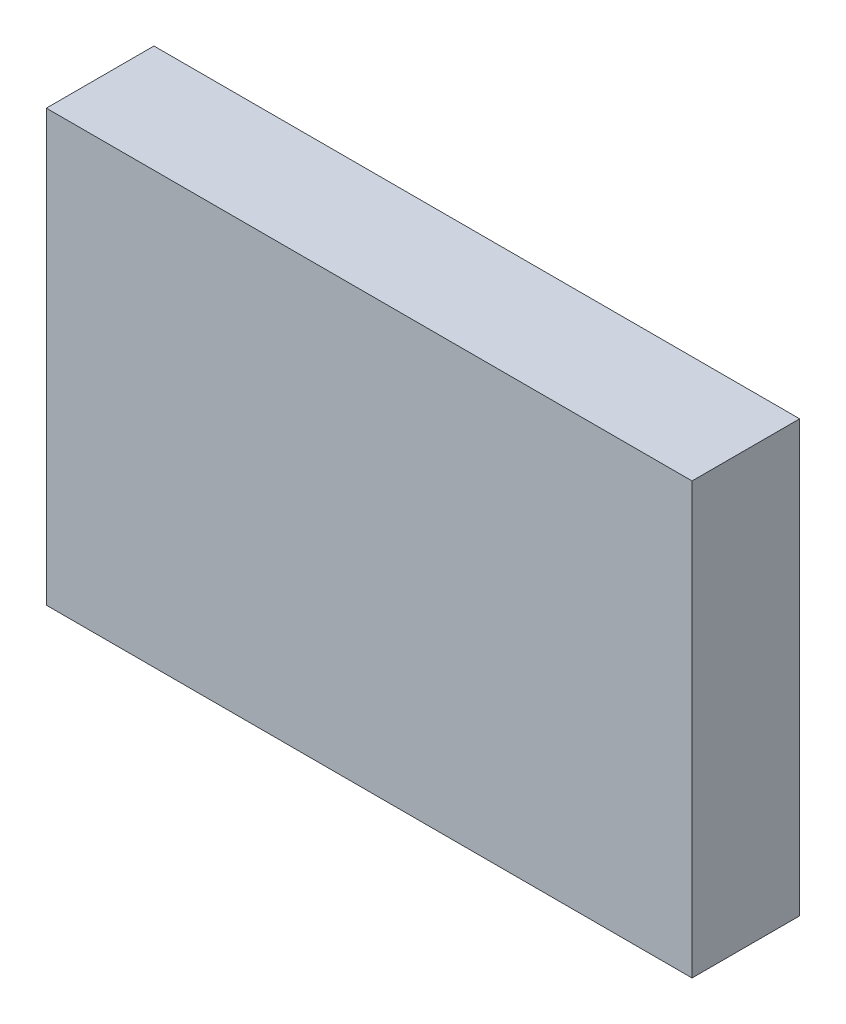
ISO-10303-21;
HEADER;
FILE_DESCRIPTION(('STEP AP214'),'2;1');
FILE_NAME('part.step','',(''),(''),'','','');
FILE_SCHEMA(('AUTOMOTIVE_DESIGN { 1 0 10303 214 1 1 1 1 }'));
ENDSEC;
DATA;
#1=APPLICATION_CONTEXT('core data for automotive mechanical design processes');
#2=APPLICATION_PROTOCOL_DEFINITION('international standard','automotive_design',2000,#1);
#3=PRODUCT_CONTEXT('',#1,'mechanical');
#4=PRODUCT('Part','Part','',(#3));
#5=PRODUCT_RELATED_PRODUCT_CATEGORY('part','',(#4));
#6=PRODUCT_DEFINITION_FORMATION('','',#4);
#7=PRODUCT_DEFINITION_CONTEXT('part definition',#1,'design');
#8=PRODUCT_DEFINITION('design','',#6,#7);
#9=PRODUCT_DEFINITION_SHAPE('','',#8);
#10=(LENGTH_UNIT() NAMED_UNIT(*) SI_UNIT(.MILLI.,.METRE.));
#11=(NAMED_UNIT(*) PLANE_ANGLE_UNIT() SI_UNIT($,.RADIAN.));
#12=(NAMED_UNIT(*) SI_UNIT($,.STERADIAN.) SOLID_ANGLE_UNIT());
#13=UNCERTAINTY_MEASURE_WITH_UNIT(LENGTH_MEASURE(1.E-05),#10,'distance_accuracy_value','');
#14=(GEOMETRIC_REPRESENTATION_CONTEXT(3) GLOBAL_UNCERTAINTY_ASSIGNED_CONTEXT((#13)) GLOBAL_UNIT_ASSIGNED_CONTEXT((#10,
#11,#12)) REPRESENTATION_CONTEXT('',''));
#15=CARTESIAN_POINT('',(0.,0.,0.));
#16=DIRECTION('',(0.,0.,1.));
#17=DIRECTION('',(1.,0.,0.));
#18=AXIS2_PLACEMENT_3D('',#15,#16,#17);
#19=CARTESIAN_POINT('',(-15.,-10.,5.));
#20=DIRECTION('',(1.,0.,0.));
#21=DIRECTION('',(0.,0.,-1.));
#22=AXIS2_PLACEMENT_3D('',#19,#20,#21);
#23=PLANE('',#22);
#24=DIRECTION('',(0.,-1.,0.));
#25=VECTOR('',#24,1.);
#26=CARTESIAN_POINT('',(-15.,-10.,0.));
#27=LINE('',#26,#25);
#28=CARTESIAN_POINT('',(-15.,9.99999999999999,0.));
#29=VERTEX_POINT('',#28);
#30=CARTESIAN_POINT('',(-15.,-10.,0.));
#31=VERTEX_POINT('',#30);
#32=EDGE_CURVE('E107',#29,#31,#27,.T.);
#33=ORIENTED_EDGE('',*,*,#32,.T.);
#34=DIRECTION('',(0.,0.,-1.));
#35=VECTOR('',#34,1.);
#36=CARTESIAN_POINT('',(-15.,-10.,5.));
#37=LINE('',#36,#35);
#38=CARTESIAN_POINT('',(-15.,-10.,5.));
#39=VERTEX_POINT('',#38);
#40=EDGE_CURVE('E11',#39,#31,#37,.T.);
#41=ORIENTED_EDGE('',*,*,#40,.F.);
#42=DIRECTION('',(0.,-1.,0.));
#43=VECTOR('',#42,1.);
#44=CARTESIAN_POINT('',(-15.,-10.,5.));
#45=LINE('',#44,#43);
#46=CARTESIAN_POINT('',(-15.,9.99999999999999,5.));
#47=VERTEX_POINT('',#46);
#48=EDGE_CURVE('E91',#47,#39,#45,.T.);
#49=ORIENTED_EDGE('',*,*,#48,.F.);
#50=DIRECTION('',(0.,0.,-1.));
#51=VECTOR('',#50,1.);
#52=CARTESIAN_POINT('',(-15.,9.99999999999999,5.));
#53=LINE('',#52,#51);
#54=EDGE_CURVE('E103',#47,#29,#53,.T.);
#55=ORIENTED_EDGE('',*,*,#54,.T.);
#56=EDGE_LOOP('',(#33,#41,#49,#55));
#57=FACE_BOUND('',#56,.T.);
#58=ADVANCED_FACE('F39',(#57),#23,.F.);
#59=CARTESIAN_POINT('',(15.,-10.,5.));
#60=DIRECTION('',(0.,1.,0.));
#61=DIRECTION('',(-1.,0.,0.));
#62=AXIS2_PLACEMENT_3D('',#59,#60,#61);
#63=PLANE('',#62);
#64=DIRECTION('',(1.,0.,0.));
#65=VECTOR('',#64,1.);
#66=CARTESIAN_POINT('',(15.,-10.,0.));
#67=LINE('',#66,#65);
#68=CARTESIAN_POINT('',(15.,-10.,0.));
#69=VERTEX_POINT('',#68);
#70=EDGE_CURVE('E96',#31,#69,#67,.T.);
#71=ORIENTED_EDGE('',*,*,#70,.T.);
#72=DIRECTION('',(0.,0.,-1.));
#73=VECTOR('',#72,1.);
#74=CARTESIAN_POINT('',(15.,-10.,5.));
#75=LINE('',#74,#73);
#76=CARTESIAN_POINT('',(15.,-10.,5.));
#77=VERTEX_POINT('',#76);
#78=EDGE_CURVE('E48',#77,#69,#75,.T.);
#79=ORIENTED_EDGE('',*,*,#78,.F.);
#80=DIRECTION('',(1.,0.,0.));
#81=VECTOR('',#80,1.);
#82=CARTESIAN_POINT('',(15.,-10.,5.));
#83=LINE('',#82,#81);
#84=EDGE_CURVE('E86',#39,#77,#83,.T.);
#85=ORIENTED_EDGE('',*,*,#84,.F.);
#86=ORIENTED_EDGE('',*,*,#40,.T.);
#87=EDGE_LOOP('',(#71,#79,#85,#86));
#88=FACE_BOUND('',#87,.T.);
#89=ADVANCED_FACE('F95',(#88),#63,.F.);
#90=CARTESIAN_POINT('',(15.,-10.,5.));
#91=DIRECTION('',(-1.,0.,0.));
#92=DIRECTION('',(0.,0.,1.));
#93=AXIS2_PLACEMENT_3D('',#90,#91,#92);
#94=PLANE('',#93);
#95=DIRECTION('',(0.,1.,0.));
#96=VECTOR('',#95,1.);
#97=CARTESIAN_POINT('',(15.,-10.,0.));
#98=LINE('',#97,#96);
#99=CARTESIAN_POINT('',(15.,10.,0.));
#100=VERTEX_POINT('',#99);
#101=EDGE_CURVE('E73',#69,#100,#98,.T.);
#102=ORIENTED_EDGE('',*,*,#101,.T.);
#103=DIRECTION('',(0.,0.,-1.));
#104=VECTOR('',#103,1.);
#105=CARTESIAN_POINT('',(15.,10.,5.));
#106=LINE('',#105,#104);
#107=CARTESIAN_POINT('',(15.,10.,5.));
#108=VERTEX_POINT('',#107);
#109=EDGE_CURVE('E98',#108,#100,#106,.T.);
#110=ORIENTED_EDGE('',*,*,#109,.F.);
#111=DIRECTION('',(0.,1.,0.));
#112=VECTOR('',#111,1.);
#113=CARTESIAN_POINT('',(15.,-10.,5.));
#114=LINE('',#113,#112);
#115=EDGE_CURVE('E89',#77,#108,#114,.T.);
#116=ORIENTED_EDGE('',*,*,#115,.F.);
#117=ORIENTED_EDGE('',*,*,#78,.T.);
#118=EDGE_LOOP('',(#102,#110,#116,#117));
#119=FACE_BOUND('',#118,.T.);
#120=ADVANCED_FACE('F99',(#119),#94,.F.);
#121=CARTESIAN_POINT('',(15.,10.,5.));
#122=DIRECTION('',(0.,-1.,0.));
#123=DIRECTION('',(1.,0.,0.));
#124=AXIS2_PLACEMENT_3D('',#121,#122,#123);
#125=PLANE('',#124);
#126=DIRECTION('',(-1.,0.,0.));
#127=VECTOR('',#126,1.);
#128=CARTESIAN_POINT('',(15.,10.,0.));
#129=LINE('',#128,#127);
#130=EDGE_CURVE('E79',#100,#29,#129,.T.);
#131=ORIENTED_EDGE('',*,*,#130,.T.);
#132=ORIENTED_EDGE('',*,*,#54,.F.);
#133=DIRECTION('',(-1.,0.,0.));
#134=VECTOR('',#133,1.);
#135=CARTESIAN_POINT('',(15.,10.,5.));
#136=LINE('',#135,#134);
#137=EDGE_CURVE('E56',#108,#47,#136,.T.);
#138=ORIENTED_EDGE('',*,*,#137,.F.);
#139=ORIENTED_EDGE('',*,*,#109,.T.);
#140=EDGE_LOOP('',(#131,#132,#138,#139));
#141=FACE_BOUND('',#140,.T.);
#142=ADVANCED_FACE('F120',(#141),#125,.F.);
#143=CARTESIAN_POINT('',(0.,0.,5.));
#144=DIRECTION('',(0.,0.,1.));
#145=DIRECTION('',(1.,0.,0.));
#146=AXIS2_PLACEMENT_3D('',#143,#144,#145);
#147=PLANE('',#146);
#148=ORIENTED_EDGE('',*,*,#48,.T.);
#149=ORIENTED_EDGE('',*,*,#84,.T.);
#150=ORIENTED_EDGE('',*,*,#115,.T.);
#151=ORIENTED_EDGE('',*,*,#137,.T.);
#152=EDGE_LOOP('',(#148,#149,#150,#151));
#153=FACE_BOUND('',#152,.T.);
#154=ADVANCED_FACE('F87',(#153),#147,.T.);
#155=CARTESIAN_POINT('',(0.,0.,0.));
#156=DIRECTION('',(0.,0.,1.));
#157=DIRECTION('',(1.,0.,0.));
#158=AXIS2_PLACEMENT_3D('',#155,#156,#157);
#159=PLANE('',#158);
#160=ORIENTED_EDGE('',*,*,#32,.F.);
#161=ORIENTED_EDGE('',*,*,#130,.F.);
#162=ORIENTED_EDGE('',*,*,#101,.F.);
#163=ORIENTED_EDGE('',*,*,#70,.F.);
#164=EDGE_LOOP('',(#160,#161,#162,#163));
#165=FACE_BOUND('',#164,.T.);
#166=ADVANCED_FACE('F123',(#165),#159,.F.);
#167=CLOSED_SHELL('',(#58,#89,#120,#142,#154,#166));
#168=MANIFOLD_SOLID_BREP('B2',#167);
#169=ADVANCED_BREP_SHAPE_REPRESENTATION('',(#18,#168),#14);
#170=SHAPE_DEFINITION_REPRESENTATION(#9,#169);
ENDSEC;
END-ISO-10303-21;
